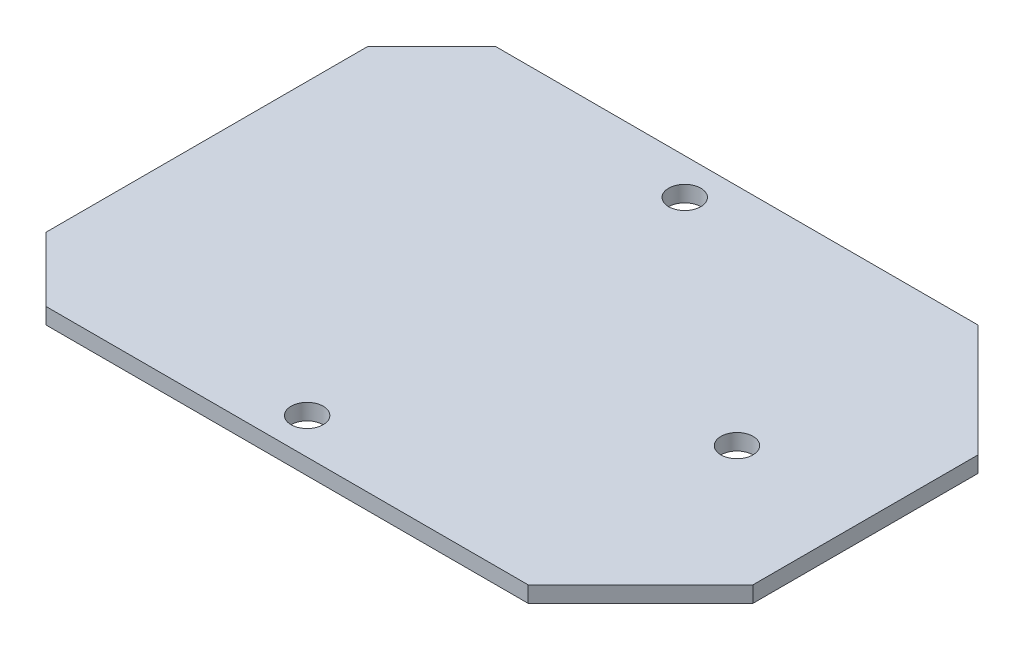
ISO-10303-21;
HEADER;
FILE_DESCRIPTION(('STEP AP214'),'2;1');
FILE_NAME('part.step','',(''),(''),'','','');
FILE_SCHEMA(('AUTOMOTIVE_DESIGN { 1 0 10303 214 1 1 1 1 }'));
ENDSEC;
DATA;
#1=APPLICATION_CONTEXT('core data for automotive mechanical design processes');
#2=APPLICATION_PROTOCOL_DEFINITION('international standard','automotive_design',2000,#1);
#3=PRODUCT_CONTEXT('',#1,'mechanical');
#4=PRODUCT('Part','Part','',(#3));
#5=PRODUCT_RELATED_PRODUCT_CATEGORY('part','',(#4));
#6=PRODUCT_DEFINITION_FORMATION('','',#4);
#7=PRODUCT_DEFINITION_CONTEXT('part definition',#1,'design');
#8=PRODUCT_DEFINITION('design','',#6,#7);
#9=PRODUCT_DEFINITION_SHAPE('','',#8);
#10=(LENGTH_UNIT() NAMED_UNIT(*) SI_UNIT(.MILLI.,.METRE.));
#11=(NAMED_UNIT(*) PLANE_ANGLE_UNIT() SI_UNIT($,.RADIAN.));
#12=(NAMED_UNIT(*) SI_UNIT($,.STERADIAN.) SOLID_ANGLE_UNIT());
#13=UNCERTAINTY_MEASURE_WITH_UNIT(LENGTH_MEASURE(1.E-05),#10,'distance_accuracy_value','');
#14=(GEOMETRIC_REPRESENTATION_CONTEXT(3) GLOBAL_UNCERTAINTY_ASSIGNED_CONTEXT((#13)) GLOBAL_UNIT_ASSIGNED_CONTEXT((#10,
#11,#12)) REPRESENTATION_CONTEXT('',''));
#15=CARTESIAN_POINT('',(0.,0.,0.));
#16=DIRECTION('',(0.,0.,1.));
#17=DIRECTION('',(1.,0.,0.));
#18=AXIS2_PLACEMENT_3D('',#15,#16,#17);
#19=CARTESIAN_POINT('',(-13.5870437204076,1.,82.6838204016366));
#20=DIRECTION('',(0.707106781186549,0.,0.707106781186546));
#21=DIRECTION('',(0.707106781186546,0.,-0.707106781186549));
#22=AXIS2_PLACEMENT_3D('',#19,#20,#21);
#23=PLANE('',#22);
#24=DIRECTION('',(-0.707106781186546,0.,0.707106781186549));
#25=VECTOR('',#24,1.);
#26=CARTESIAN_POINT('',(-13.5870437204076,0.,82.6838204016366));
#27=LINE('',#26,#25);
#28=CARTESIAN_POINT('',(-9.58704372040764,0.,78.6838204016365));
#29=VERTEX_POINT('',#28);
#30=CARTESIAN_POINT('',(-13.5870437204076,0.,82.6838204016366));
#31=VERTEX_POINT('',#30);
#32=EDGE_CURVE('E142',#29,#31,#27,.T.);
#33=ORIENTED_EDGE('',*,*,#32,.T.);
#34=DIRECTION('',(0.,-1.,0.));
#35=VECTOR('',#34,1.);
#36=CARTESIAN_POINT('',(-13.5870437204076,1.,82.6838204016366));
#37=LINE('',#36,#35);
#38=CARTESIAN_POINT('',(-13.5870437204076,1.,82.6838204016366));
#39=VERTEX_POINT('',#38);
#40=EDGE_CURVE('E11',#39,#31,#37,.T.);
#41=ORIENTED_EDGE('',*,*,#40,.F.);
#42=DIRECTION('',(-0.707106781186546,0.,0.707106781186549));
#43=VECTOR('',#42,1.);
#44=CARTESIAN_POINT('',(-13.5870437204076,1.,82.6838204016366));
#45=LINE('',#44,#43);
#46=CARTESIAN_POINT('',(-9.58704372040764,1.,78.6838204016365));
#47=VERTEX_POINT('',#46);
#48=EDGE_CURVE('E165',#47,#39,#45,.T.);
#49=ORIENTED_EDGE('',*,*,#48,.F.);
#50=DIRECTION('',(0.,-1.,0.));
#51=VECTOR('',#50,1.);
#52=CARTESIAN_POINT('',(-9.58704372040764,1.,78.6838204016365));
#53=LINE('',#52,#51);
#54=EDGE_CURVE('E138',#47,#29,#53,.T.);
#55=ORIENTED_EDGE('',*,*,#54,.T.);
#56=EDGE_LOOP('',(#33,#41,#49,#55));
#57=FACE_BOUND('',#56,.T.);
#58=ADVANCED_FACE('F41',(#57),#23,.F.);
#59=CARTESIAN_POINT('',(-13.5870437204076,1.,102.683820401637));
#60=DIRECTION('',(1.,0.,0.));
#61=DIRECTION('',(0.,0.,-1.));
#62=AXIS2_PLACEMENT_3D('',#59,#60,#61);
#63=PLANE('',#62);
#64=DIRECTION('',(0.,0.,1.));
#65=VECTOR('',#64,1.);
#66=CARTESIAN_POINT('',(-13.5870437204076,0.,102.683820401637));
#67=LINE('',#66,#65);
#68=CARTESIAN_POINT('',(-13.5870437204076,0.,102.683820401637));
#69=VERTEX_POINT('',#68);
#70=EDGE_CURVE('E146',#31,#69,#67,.T.);
#71=ORIENTED_EDGE('',*,*,#70,.T.);
#72=DIRECTION('',(0.,-1.,0.));
#73=VECTOR('',#72,1.);
#74=CARTESIAN_POINT('',(-13.5870437204076,1.,102.683820401637));
#75=LINE('',#74,#73);
#76=CARTESIAN_POINT('',(-13.5870437204076,1.,102.683820401637));
#77=VERTEX_POINT('',#76);
#78=EDGE_CURVE('E50',#77,#69,#75,.T.);
#79=ORIENTED_EDGE('',*,*,#78,.F.);
#80=DIRECTION('',(0.,0.,1.));
#81=VECTOR('',#80,1.);
#82=CARTESIAN_POINT('',(-13.5870437204076,1.,102.683820401637));
#83=LINE('',#82,#81);
#84=EDGE_CURVE('E101',#39,#77,#83,.T.);
#85=ORIENTED_EDGE('',*,*,#84,.F.);
#86=ORIENTED_EDGE('',*,*,#40,.T.);
#87=EDGE_LOOP('',(#71,#79,#85,#86));
#88=FACE_BOUND('',#87,.T.);
#89=ADVANCED_FACE('F263',(#88),#63,.F.);
#90=CARTESIAN_POINT('',(-9.58704372040759,1.,106.683820401636));
#91=DIRECTION('',(0.707106781186546,0.,-0.707106781186549));
#92=DIRECTION('',(-0.707106781186549,0.,-0.707106781186546));
#93=AXIS2_PLACEMENT_3D('',#90,#91,#92);
#94=PLANE('',#93);
#95=DIRECTION('',(0.707106781186549,0.,0.707106781186546));
#96=VECTOR('',#95,1.);
#97=CARTESIAN_POINT('',(-9.58704372040759,0.,106.683820401636));
#98=LINE('',#97,#96);
#99=CARTESIAN_POINT('',(-9.58704372040759,0.,106.683820401636));
#100=VERTEX_POINT('',#99);
#101=EDGE_CURVE('E150',#69,#100,#98,.T.);
#102=ORIENTED_EDGE('',*,*,#101,.T.);
#103=DIRECTION('',(0.,-1.,0.));
#104=VECTOR('',#103,1.);
#105=CARTESIAN_POINT('',(-9.58704372040759,1.,106.683820401636));
#106=LINE('',#105,#104);
#107=CARTESIAN_POINT('',(-9.58704372040759,1.,106.683820401636));
#108=VERTEX_POINT('',#107);
#109=EDGE_CURVE('E176',#108,#100,#106,.T.);
#110=ORIENTED_EDGE('',*,*,#109,.F.);
#111=DIRECTION('',(0.707106781186549,0.,0.707106781186546));
#112=VECTOR('',#111,1.);
#113=CARTESIAN_POINT('',(-9.58704372040759,1.,106.683820401636));
#114=LINE('',#113,#112);
#115=EDGE_CURVE('E186',#77,#108,#114,.T.);
#116=ORIENTED_EDGE('',*,*,#115,.F.);
#117=ORIENTED_EDGE('',*,*,#78,.T.);
#118=EDGE_LOOP('',(#102,#110,#116,#117));
#119=FACE_BOUND('',#118,.T.);
#120=ADVANCED_FACE('F184',(#119),#94,.F.);
#121=CARTESIAN_POINT('',(20.4129562795924,1.,106.683820401637));
#122=DIRECTION('',(0.,0.,-1.));
#123=DIRECTION('',(-1.,0.,0.));
#124=AXIS2_PLACEMENT_3D('',#121,#122,#123);
#125=PLANE('',#124);
#126=DIRECTION('',(1.,0.,0.));
#127=VECTOR('',#126,1.);
#128=CARTESIAN_POINT('',(20.4129562795924,0.,106.683820401637));
#129=LINE('',#128,#127);
#130=CARTESIAN_POINT('',(20.4129562795924,0.,106.683820401637));
#131=VERTEX_POINT('',#130);
#132=EDGE_CURVE('E153',#100,#131,#129,.T.);
#133=ORIENTED_EDGE('',*,*,#132,.T.);
#134=DIRECTION('',(0.,-1.,0.));
#135=VECTOR('',#134,1.);
#136=CARTESIAN_POINT('',(20.4129562795924,1.,106.683820401637));
#137=LINE('',#136,#135);
#138=CARTESIAN_POINT('',(20.4129562795924,1.,106.683820401637));
#139=VERTEX_POINT('',#138);
#140=EDGE_CURVE('E172',#139,#131,#137,.T.);
#141=ORIENTED_EDGE('',*,*,#140,.F.);
#142=DIRECTION('',(1.,0.,0.));
#143=VECTOR('',#142,1.);
#144=CARTESIAN_POINT('',(20.4129562795924,1.,106.683820401637));
#145=LINE('',#144,#143);
#146=EDGE_CURVE('E199',#108,#139,#145,.T.);
#147=ORIENTED_EDGE('',*,*,#146,.F.);
#148=ORIENTED_EDGE('',*,*,#109,.T.);
#149=EDGE_LOOP('',(#133,#141,#147,#148));
#150=FACE_BOUND('',#149,.T.);
#151=ADVANCED_FACE('F194',(#150),#125,.F.);
#152=CARTESIAN_POINT('',(27.4129562795924,1.,99.6838204016365));
#153=DIRECTION('',(-0.707106781186547,0.,-0.707106781186547));
#154=DIRECTION('',(-0.707106781186548,0.,0.707106781186548));
#155=AXIS2_PLACEMENT_3D('',#152,#153,#154);
#156=PLANE('',#155);
#157=DIRECTION('',(0.707106781186547,0.,-0.707106781186547));
#158=VECTOR('',#157,1.);
#159=CARTESIAN_POINT('',(27.4129562795924,0.,99.6838204016365));
#160=LINE('',#159,#158);
#161=CARTESIAN_POINT('',(27.4129562795924,0.,99.6838204016365));
#162=VERTEX_POINT('',#161);
#163=EDGE_CURVE('E156',#131,#162,#160,.T.);
#164=ORIENTED_EDGE('',*,*,#163,.T.);
#165=DIRECTION('',(0.,-1.,0.));
#166=VECTOR('',#165,1.);
#167=CARTESIAN_POINT('',(27.4129562795924,1.,99.6838204016365));
#168=LINE('',#167,#166);
#169=CARTESIAN_POINT('',(27.4129562795924,1.,99.6838204016365));
#170=VERTEX_POINT('',#169);
#171=EDGE_CURVE('E131',#170,#162,#168,.T.);
#172=ORIENTED_EDGE('',*,*,#171,.F.);
#173=DIRECTION('',(0.707106781186547,0.,-0.707106781186547));
#174=VECTOR('',#173,1.);
#175=CARTESIAN_POINT('',(27.4129562795924,1.,99.6838204016365));
#176=LINE('',#175,#174);
#177=EDGE_CURVE('E120',#139,#170,#176,.T.);
#178=ORIENTED_EDGE('',*,*,#177,.F.);
#179=ORIENTED_EDGE('',*,*,#140,.T.);
#180=EDGE_LOOP('',(#164,#172,#178,#179));
#181=FACE_BOUND('',#180,.T.);
#182=ADVANCED_FACE('F197',(#181),#156,.F.);
#183=CARTESIAN_POINT('',(27.4129562795924,1.,85.6838204016366));
#184=DIRECTION('',(-1.,0.,0.));
#185=DIRECTION('',(0.,0.,1.));
#186=AXIS2_PLACEMENT_3D('',#183,#184,#185);
#187=PLANE('',#186);
#188=DIRECTION('',(0.,0.,-1.));
#189=VECTOR('',#188,1.);
#190=CARTESIAN_POINT('',(27.4129562795924,0.,85.6838204016366));
#191=LINE('',#190,#189);
#192=CARTESIAN_POINT('',(27.4129562795924,0.,85.6838204016366));
#193=VERTEX_POINT('',#192);
#194=EDGE_CURVE('E129',#162,#193,#191,.T.);
#195=ORIENTED_EDGE('',*,*,#194,.T.);
#196=DIRECTION('',(0.,-1.,0.));
#197=VECTOR('',#196,1.);
#198=CARTESIAN_POINT('',(27.4129562795924,1.,85.6838204016366));
#199=LINE('',#198,#197);
#200=CARTESIAN_POINT('',(27.4129562795924,1.,85.6838204016366));
#201=VERTEX_POINT('',#200);
#202=EDGE_CURVE('E126',#201,#193,#199,.T.);
#203=ORIENTED_EDGE('',*,*,#202,.F.);
#204=DIRECTION('',(0.,0.,-1.));
#205=VECTOR('',#204,1.);
#206=CARTESIAN_POINT('',(27.4129562795924,1.,85.6838204016366));
#207=LINE('',#206,#205);
#208=EDGE_CURVE('E114',#170,#201,#207,.T.);
#209=ORIENTED_EDGE('',*,*,#208,.F.);
#210=ORIENTED_EDGE('',*,*,#171,.T.);
#211=EDGE_LOOP('',(#195,#203,#209,#210));
#212=FACE_BOUND('',#211,.T.);
#213=ADVANCED_FACE('F127',(#212),#187,.F.);
#214=CARTESIAN_POINT('',(20.4129562795923,1.,78.6838204016365));
#215=DIRECTION('',(-0.707106781186546,0.,0.707106781186549));
#216=DIRECTION('',(0.707106781186549,0.,0.707106781186546));
#217=AXIS2_PLACEMENT_3D('',#214,#215,#216);
#218=PLANE('',#217);
#219=DIRECTION('',(-0.707106781186549,0.,-0.707106781186546));
#220=VECTOR('',#219,1.);
#221=CARTESIAN_POINT('',(20.4129562795923,0.,78.6838204016365));
#222=LINE('',#221,#220);
#223=CARTESIAN_POINT('',(20.4129562795923,0.,78.6838204016365));
#224=VERTEX_POINT('',#223);
#225=EDGE_CURVE('E87',#193,#224,#222,.T.);
#226=ORIENTED_EDGE('',*,*,#225,.T.);
#227=DIRECTION('',(0.,-1.,0.));
#228=VECTOR('',#227,1.);
#229=CARTESIAN_POINT('',(20.4129562795923,1.,78.6838204016365));
#230=LINE('',#229,#228);
#231=CARTESIAN_POINT('',(20.4129562795923,1.,78.6838204016365));
#232=VERTEX_POINT('',#231);
#233=EDGE_CURVE('E132',#232,#224,#230,.T.);
#234=ORIENTED_EDGE('',*,*,#233,.F.);
#235=DIRECTION('',(-0.707106781186549,0.,-0.707106781186546));
#236=VECTOR('',#235,1.);
#237=CARTESIAN_POINT('',(20.4129562795923,1.,78.6838204016365));
#238=LINE('',#237,#236);
#239=EDGE_CURVE('E118',#201,#232,#238,.T.);
#240=ORIENTED_EDGE('',*,*,#239,.F.);
#241=ORIENTED_EDGE('',*,*,#202,.T.);
#242=EDGE_LOOP('',(#226,#234,#240,#241));
#243=FACE_BOUND('',#242,.T.);
#244=ADVANCED_FACE('F134',(#243),#218,.F.);
#245=CARTESIAN_POINT('',(-9.58704372040764,1.,78.6838204016365));
#246=DIRECTION('',(0.,0.,1.));
#247=DIRECTION('',(1.,0.,0.));
#248=AXIS2_PLACEMENT_3D('',#245,#246,#247);
#249=PLANE('',#248);
#250=DIRECTION('',(-1.,0.,0.));
#251=VECTOR('',#250,1.);
#252=CARTESIAN_POINT('',(-9.58704372040764,0.,78.6838204016365));
#253=LINE('',#252,#251);
#254=EDGE_CURVE('E93',#224,#29,#253,.T.);
#255=ORIENTED_EDGE('',*,*,#254,.T.);
#256=ORIENTED_EDGE('',*,*,#54,.F.);
#257=DIRECTION('',(-1.,0.,0.));
#258=VECTOR('',#257,1.);
#259=CARTESIAN_POINT('',(-9.58704372040764,1.,78.6838204016365));
#260=LINE('',#259,#258);
#261=EDGE_CURVE('E58',#232,#47,#260,.T.);
#262=ORIENTED_EDGE('',*,*,#261,.F.);
#263=ORIENTED_EDGE('',*,*,#233,.T.);
#264=EDGE_LOOP('',(#255,#256,#262,#263));
#265=FACE_BOUND('',#264,.T.);
#266=ADVANCED_FACE('F244',(#265),#249,.F.);
#267=CARTESIAN_POINT('',(0.,1.,0.));
#268=DIRECTION('',(0.,-1.,0.));
#269=DIRECTION('',(0.,0.,-1.));
#270=AXIS2_PLACEMENT_3D('',#267,#268,#269);
#271=PLANE('',#270);
#272=CARTESIAN_POINT('',(4.41295627959239,1.,104.433820401637));
#273=DIRECTION('',(0.,1.,0.));
#274=DIRECTION('',(0.,0.,1.));
#275=AXIS2_PLACEMENT_3D('',#272,#273,#274);
#276=CIRCLE('',#275,1.);
#277=CARTESIAN_POINT('',(4.41295627959239,1.,105.433820401637));
#278=VERTEX_POINT('',#277);
#279=EDGE_CURVE('E225',#278,#278,#276,.T.);
#280=ORIENTED_EDGE('',*,*,#279,.F.);
#281=EDGE_LOOP('',(#280));
#282=FACE_BOUND('',#281,.T.);
#283=CARTESIAN_POINT('',(4.41295627959239,1.,80.9338204016365));
#284=DIRECTION('',(0.,1.,0.));
#285=DIRECTION('',(0.,0.,1.));
#286=AXIS2_PLACEMENT_3D('',#283,#284,#285);
#287=CIRCLE('',#286,1.);
#288=CARTESIAN_POINT('',(4.41295627959239,1.,81.9338204016365));
#289=VERTEX_POINT('',#288);
#290=EDGE_CURVE('E217',#289,#289,#287,.T.);
#291=ORIENTED_EDGE('',*,*,#290,.F.);
#292=EDGE_LOOP('',(#291));
#293=FACE_BOUND('',#292,.T.);
#294=CARTESIAN_POINT('',(19.4129562795924,1.,92.6838204016365));
#295=DIRECTION('',(0.,1.,0.));
#296=DIRECTION('',(0.,0.,1.));
#297=AXIS2_PLACEMENT_3D('',#294,#295,#296);
#298=CIRCLE('',#297,1.);
#299=CARTESIAN_POINT('',(19.4129562795924,1.,93.6838204016365));
#300=VERTEX_POINT('',#299);
#301=EDGE_CURVE('E209',#300,#300,#298,.T.);
#302=ORIENTED_EDGE('',*,*,#301,.F.);
#303=EDGE_LOOP('',(#302));
#304=FACE_BOUND('',#303,.T.);
#305=ORIENTED_EDGE('',*,*,#48,.T.);
#306=ORIENTED_EDGE('',*,*,#84,.T.);
#307=ORIENTED_EDGE('',*,*,#115,.T.);
#308=ORIENTED_EDGE('',*,*,#146,.T.);
#309=ORIENTED_EDGE('',*,*,#177,.T.);
#310=ORIENTED_EDGE('',*,*,#208,.T.);
#311=ORIENTED_EDGE('',*,*,#239,.T.);
#312=ORIENTED_EDGE('',*,*,#261,.T.);
#313=EDGE_LOOP('',(#305,#306,#307,#308,#309,#310,#311,#312));
#314=FACE_BOUND('',#313,.T.);
#315=ADVANCED_FACE('F116',(#282,#293,#304,#314),#271,.F.);
#316=CARTESIAN_POINT('',(0.,0.,0.));
#317=DIRECTION('',(0.,-1.,0.));
#318=DIRECTION('',(0.,0.,-1.));
#319=AXIS2_PLACEMENT_3D('',#316,#317,#318);
#320=PLANE('',#319);
#321=CARTESIAN_POINT('',(4.41295627959239,0.,104.433820401637));
#322=DIRECTION('',(0.,1.,0.));
#323=DIRECTION('',(0.,0.,1.));
#324=AXIS2_PLACEMENT_3D('',#321,#322,#323);
#325=CIRCLE('',#324,1.);
#326=CARTESIAN_POINT('',(4.41295627959239,0.,105.433820401637));
#327=VERTEX_POINT('',#326);
#328=EDGE_CURVE('E213',#327,#327,#325,.T.);
#329=ORIENTED_EDGE('',*,*,#328,.T.);
#330=EDGE_LOOP('',(#329));
#331=FACE_BOUND('',#330,.T.);
#332=CARTESIAN_POINT('',(4.41295627959239,0.,80.9338204016365));
#333=DIRECTION('',(0.,1.,0.));
#334=DIRECTION('',(0.,0.,1.));
#335=AXIS2_PLACEMENT_3D('',#332,#333,#334);
#336=CIRCLE('',#335,1.);
#337=CARTESIAN_POINT('',(4.41295627959239,0.,81.9338204016365));
#338=VERTEX_POINT('',#337);
#339=EDGE_CURVE('E221',#338,#338,#336,.T.);
#340=ORIENTED_EDGE('',*,*,#339,.T.);
#341=EDGE_LOOP('',(#340));
#342=FACE_BOUND('',#341,.T.);
#343=CARTESIAN_POINT('',(19.4129562795924,0.,92.6838204016365));
#344=DIRECTION('',(0.,1.,0.));
#345=DIRECTION('',(0.,0.,1.));
#346=AXIS2_PLACEMENT_3D('',#343,#344,#345);
#347=CIRCLE('',#346,1.);
#348=CARTESIAN_POINT('',(19.4129562795924,0.,93.6838204016365));
#349=VERTEX_POINT('',#348);
#350=EDGE_CURVE('E147',#349,#349,#347,.T.);
#351=ORIENTED_EDGE('',*,*,#350,.T.);
#352=EDGE_LOOP('',(#351));
#353=FACE_BOUND('',#352,.T.);
#354=ORIENTED_EDGE('',*,*,#32,.F.);
#355=ORIENTED_EDGE('',*,*,#254,.F.);
#356=ORIENTED_EDGE('',*,*,#225,.F.);
#357=ORIENTED_EDGE('',*,*,#194,.F.);
#358=ORIENTED_EDGE('',*,*,#163,.F.);
#359=ORIENTED_EDGE('',*,*,#132,.F.);
#360=ORIENTED_EDGE('',*,*,#101,.F.);
#361=ORIENTED_EDGE('',*,*,#70,.F.);
#362=EDGE_LOOP('',(#354,#355,#356,#357,#358,#359,#360,#361));
#363=FACE_BOUND('',#362,.T.);
#364=ADVANCED_FACE('F190',(#331,#342,#353,#363),#320,.T.);
#365=CARTESIAN_POINT('',(19.4129562795924,0.,92.6838204016365));
#366=DIRECTION('',(0.,1.,0.));
#367=DIRECTION('',(0.,0.,1.));
#368=AXIS2_PLACEMENT_3D('',#365,#366,#367);
#369=CYLINDRICAL_SURFACE('',#368,1.);
#370=ORIENTED_EDGE('',*,*,#350,.F.);
#371=EDGE_LOOP('',(#370));
#372=FACE_BOUND('',#371,.T.);
#373=ORIENTED_EDGE('',*,*,#301,.T.);
#374=EDGE_LOOP('',(#373));
#375=FACE_BOUND('',#374,.T.);
#376=ADVANCED_FACE('F250',(#372,#375),#369,.F.);
#377=CARTESIAN_POINT('',(4.41295627959239,0.,80.9338204016365));
#378=DIRECTION('',(0.,1.,0.));
#379=DIRECTION('',(0.,0.,1.));
#380=AXIS2_PLACEMENT_3D('',#377,#378,#379);
#381=CYLINDRICAL_SURFACE('',#380,1.);
#382=ORIENTED_EDGE('',*,*,#339,.F.);
#383=EDGE_LOOP('',(#382));
#384=FACE_BOUND('',#383,.T.);
#385=ORIENTED_EDGE('',*,*,#290,.T.);
#386=EDGE_LOOP('',(#385));
#387=FACE_BOUND('',#386,.T.);
#388=ADVANCED_FACE('F238',(#384,#387),#381,.F.);
#389=CARTESIAN_POINT('',(4.41295627959239,0.,104.433820401637));
#390=DIRECTION('',(0.,1.,0.));
#391=DIRECTION('',(0.,0.,1.));
#392=AXIS2_PLACEMENT_3D('',#389,#390,#391);
#393=CYLINDRICAL_SURFACE('',#392,1.);
#394=ORIENTED_EDGE('',*,*,#328,.F.);
#395=EDGE_LOOP('',(#394));
#396=FACE_BOUND('',#395,.T.);
#397=ORIENTED_EDGE('',*,*,#279,.T.);
#398=EDGE_LOOP('',(#397));
#399=FACE_BOUND('',#398,.T.);
#400=ADVANCED_FACE('F235',(#396,#399),#393,.F.);
#401=CLOSED_SHELL('',(#58,#89,#120,#151,#182,#213,#244,#266,#315,#364,#376,#388,#400));
#402=MANIFOLD_SOLID_BREP('B2',#401);
#403=ADVANCED_BREP_SHAPE_REPRESENTATION('',(#18,#402),#14);
#404=SHAPE_DEFINITION_REPRESENTATION(#9,#403);
ENDSEC;
END-ISO-10303-21;
